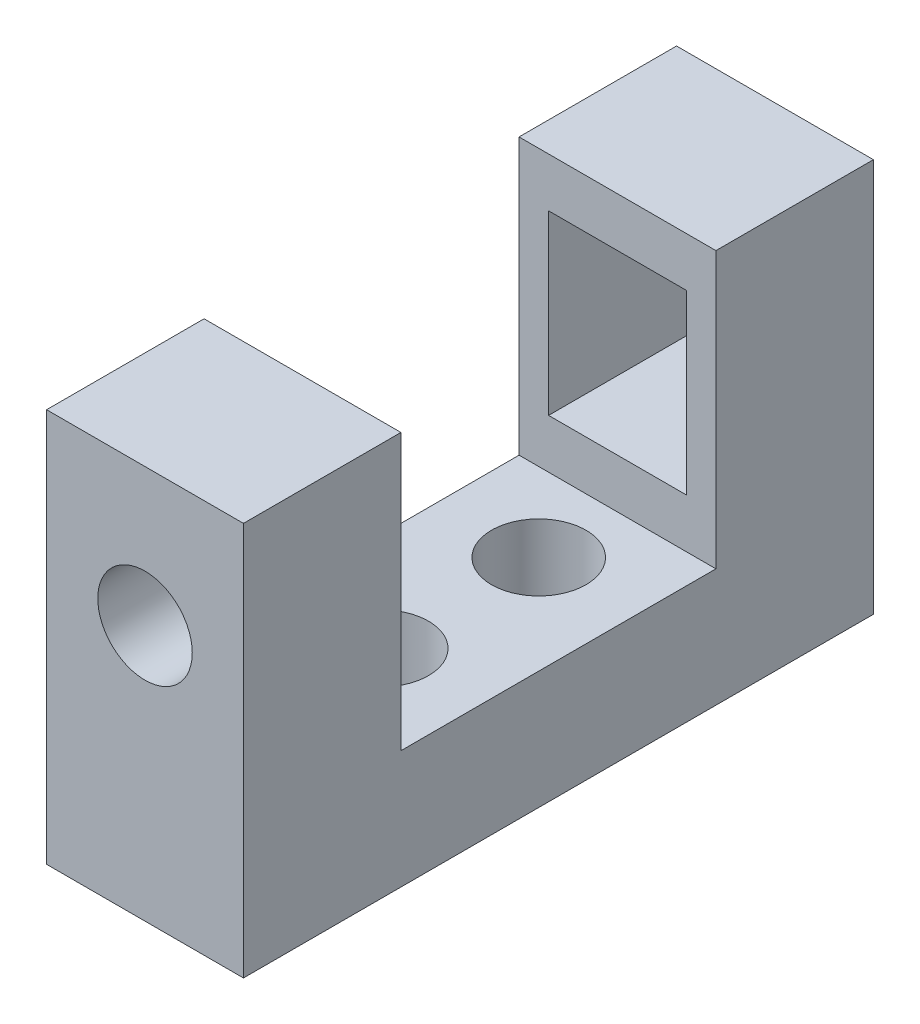
ISO-10303-21;
HEADER;
FILE_DESCRIPTION(('STEP AP214'),'2;1');
FILE_NAME('part.step','',(''),(''),'','','');
FILE_SCHEMA(('AUTOMOTIVE_DESIGN { 1 0 10303 214 1 1 1 1 }'));
ENDSEC;
DATA;
#1=APPLICATION_CONTEXT('core data for automotive mechanical design processes');
#2=APPLICATION_PROTOCOL_DEFINITION('international standard','automotive_design',2000,#1);
#3=PRODUCT_CONTEXT('',#1,'mechanical');
#4=PRODUCT('Part','Part','',(#3));
#5=PRODUCT_RELATED_PRODUCT_CATEGORY('part','',(#4));
#6=PRODUCT_DEFINITION_FORMATION('','',#4);
#7=PRODUCT_DEFINITION_CONTEXT('part definition',#1,'design');
#8=PRODUCT_DEFINITION('design','',#6,#7);
#9=PRODUCT_DEFINITION_SHAPE('','',#8);
#10=(LENGTH_UNIT() NAMED_UNIT(*) SI_UNIT(.MILLI.,.METRE.));
#11=(NAMED_UNIT(*) PLANE_ANGLE_UNIT() SI_UNIT($,.RADIAN.));
#12=(NAMED_UNIT(*) SI_UNIT($,.STERADIAN.) SOLID_ANGLE_UNIT());
#13=UNCERTAINTY_MEASURE_WITH_UNIT(LENGTH_MEASURE(1.E-05),#10,'distance_accuracy_value','');
#14=(GEOMETRIC_REPRESENTATION_CONTEXT(3) GLOBAL_UNCERTAINTY_ASSIGNED_CONTEXT((#13)) GLOBAL_UNIT_ASSIGNED_CONTEXT((#10,
#11,#12)) REPRESENTATION_CONTEXT('',''));
#15=CARTESIAN_POINT('',(0.,0.,0.));
#16=DIRECTION('',(0.,0.,1.));
#17=DIRECTION('',(1.,0.,0.));
#18=AXIS2_PLACEMENT_3D('',#15,#16,#17);
#19=CARTESIAN_POINT('',(2.5,3.5,2.));
#20=DIRECTION('',(-1.,0.,0.));
#21=DIRECTION('',(0.,-1.,0.));
#22=AXIS2_PLACEMENT_3D('',#19,#20,#21);
#23=PLANE('',#22);
#24=DIRECTION('',(0.,1.,0.));
#25=VECTOR('',#24,1.);
#26=CARTESIAN_POINT('',(2.5,3.5,-2.));
#27=LINE('',#26,#25);
#28=CARTESIAN_POINT('',(2.5,-6.5,-2.));
#29=VERTEX_POINT('',#28);
#30=CARTESIAN_POINT('',(2.5,3.5,-2.));
#31=VERTEX_POINT('',#30);
#32=EDGE_CURVE('E122',#29,#31,#27,.T.);
#33=ORIENTED_EDGE('',*,*,#32,.T.);
#34=DIRECTION('',(0.,0.,-1.));
#35=VECTOR('',#34,1.);
#36=CARTESIAN_POINT('',(2.5,3.5,2.));
#37=LINE('',#36,#35);
#38=CARTESIAN_POINT('',(2.5,3.5,2.));
#39=VERTEX_POINT('',#38);
#40=EDGE_CURVE('E11',#39,#31,#37,.T.);
#41=ORIENTED_EDGE('',*,*,#40,.F.);
#42=DIRECTION('',(0.,1.,0.));
#43=VECTOR('',#42,1.);
#44=CARTESIAN_POINT('',(2.5,3.5,2.));
#45=LINE('',#44,#43);
#46=CARTESIAN_POINT('',(2.5,-3.5,2.));
#47=VERTEX_POINT('',#46);
#48=EDGE_CURVE('E158',#47,#39,#45,.T.);
#49=ORIENTED_EDGE('',*,*,#48,.F.);
#50=DIRECTION('',(0.,0.,1.));
#51=VECTOR('',#50,1.);
#52=CARTESIAN_POINT('',(2.5,-3.5,2.));
#53=LINE('',#52,#51);
#54=CARTESIAN_POINT('',(2.5,-3.5,10.));
#55=VERTEX_POINT('',#54);
#56=EDGE_CURVE('E152',#47,#55,#53,.T.);
#57=ORIENTED_EDGE('',*,*,#56,.T.);
#58=DIRECTION('',(0.,-1.,0.));
#59=VECTOR('',#58,1.);
#60=CARTESIAN_POINT('',(2.5,3.5,10.));
#61=LINE('',#60,#59);
#62=CARTESIAN_POINT('',(2.5,3.5,10.));
#63=VERTEX_POINT('',#62);
#64=EDGE_CURVE('E154',#63,#55,#61,.T.);
#65=ORIENTED_EDGE('',*,*,#64,.F.);
#66=DIRECTION('',(0.,0.,-1.));
#67=VECTOR('',#66,1.);
#68=CARTESIAN_POINT('',(2.5,3.5,14.));
#69=LINE('',#68,#67);
#70=CARTESIAN_POINT('',(2.5,3.5,14.));
#71=VERTEX_POINT('',#70);
#72=EDGE_CURVE('E193',#71,#63,#69,.T.);
#73=ORIENTED_EDGE('',*,*,#72,.F.);
#74=DIRECTION('',(0.,1.,0.));
#75=VECTOR('',#74,1.);
#76=CARTESIAN_POINT('',(2.5,-6.5,14.));
#77=LINE('',#76,#75);
#78=CARTESIAN_POINT('',(2.5,-6.5,14.));
#79=VERTEX_POINT('',#78);
#80=EDGE_CURVE('E132',#79,#71,#77,.T.);
#81=ORIENTED_EDGE('',*,*,#80,.F.);
#82=DIRECTION('',(0.,0.,1.));
#83=VECTOR('',#82,1.);
#84=CARTESIAN_POINT('',(2.5,-6.5,2.));
#85=LINE('',#84,#83);
#86=EDGE_CURVE('E135',#29,#79,#85,.T.);
#87=ORIENTED_EDGE('',*,*,#86,.F.);
#88=EDGE_LOOP('',(#33,#41,#49,#57,#65,#73,#81,#87));
#89=FACE_BOUND('',#88,.T.);
#90=ADVANCED_FACE('F33',(#89),#23,.F.);
#91=CARTESIAN_POINT('',(-2.5,3.5,2.));
#92=DIRECTION('',(0.,-1.,0.));
#93=DIRECTION('',(0.,0.,-1.));
#94=AXIS2_PLACEMENT_3D('',#91,#92,#93);
#95=PLANE('',#94);
#96=DIRECTION('',(-1.,0.,0.));
#97=VECTOR('',#96,1.);
#98=CARTESIAN_POINT('',(-2.5,3.5,-2.));
#99=LINE('',#98,#97);
#100=CARTESIAN_POINT('',(-2.5,3.5,-2.));
#101=VERTEX_POINT('',#100);
#102=EDGE_CURVE('E129',#31,#101,#99,.T.);
#103=ORIENTED_EDGE('',*,*,#102,.T.);
#104=DIRECTION('',(0.,0.,-1.));
#105=VECTOR('',#104,1.);
#106=CARTESIAN_POINT('',(-2.5,3.5,2.));
#107=LINE('',#106,#105);
#108=CARTESIAN_POINT('',(-2.5,3.5,2.));
#109=VERTEX_POINT('',#108);
#110=EDGE_CURVE('E40',#109,#101,#107,.T.);
#111=ORIENTED_EDGE('',*,*,#110,.F.);
#112=DIRECTION('',(-1.,0.,0.));
#113=VECTOR('',#112,1.);
#114=CARTESIAN_POINT('',(-2.5,3.5,2.));
#115=LINE('',#114,#113);
#116=EDGE_CURVE('E161',#39,#109,#115,.T.);
#117=ORIENTED_EDGE('',*,*,#116,.F.);
#118=ORIENTED_EDGE('',*,*,#40,.T.);
#119=EDGE_LOOP('',(#103,#111,#117,#118));
#120=FACE_BOUND('',#119,.T.);
#121=ADVANCED_FACE('F177',(#120),#95,.F.);
#122=CARTESIAN_POINT('',(-2.5,3.5,2.));
#123=DIRECTION('',(1.,0.,0.));
#124=DIRECTION('',(0.,1.,0.));
#125=AXIS2_PLACEMENT_3D('',#122,#123,#124);
#126=PLANE('',#125);
#127=DIRECTION('',(0.,-1.,0.));
#128=VECTOR('',#127,1.);
#129=CARTESIAN_POINT('',(-2.5,3.5,-2.));
#130=LINE('',#129,#128);
#131=CARTESIAN_POINT('',(-2.5,-6.5,-2.));
#132=VERTEX_POINT('',#131);
#133=EDGE_CURVE('E162',#101,#132,#130,.T.);
#134=ORIENTED_EDGE('',*,*,#133,.T.);
#135=DIRECTION('',(0.,0.,-1.));
#136=VECTOR('',#135,1.);
#137=CARTESIAN_POINT('',(-2.5,-6.5,-2.));
#138=LINE('',#137,#136);
#139=CARTESIAN_POINT('',(-2.5,-6.5,14.));
#140=VERTEX_POINT('',#139);
#141=EDGE_CURVE('E144',#140,#132,#138,.T.);
#142=ORIENTED_EDGE('',*,*,#141,.F.);
#143=DIRECTION('',(0.,1.,0.));
#144=VECTOR('',#143,1.);
#145=CARTESIAN_POINT('',(-2.5,-6.5,14.));
#146=LINE('',#145,#144);
#147=CARTESIAN_POINT('',(-2.5,3.5,14.));
#148=VERTEX_POINT('',#147);
#149=EDGE_CURVE('E151',#140,#148,#146,.T.);
#150=ORIENTED_EDGE('',*,*,#149,.T.);
#151=DIRECTION('',(0.,0.,1.));
#152=VECTOR('',#151,1.);
#153=CARTESIAN_POINT('',(-2.5,3.5,14.));
#154=LINE('',#153,#152);
#155=CARTESIAN_POINT('',(-2.5,3.5,10.));
#156=VERTEX_POINT('',#155);
#157=EDGE_CURVE('E214',#156,#148,#154,.T.);
#158=ORIENTED_EDGE('',*,*,#157,.F.);
#159=DIRECTION('',(0.,-1.,0.));
#160=VECTOR('',#159,1.);
#161=CARTESIAN_POINT('',(-2.5,3.5,10.));
#162=LINE('',#161,#160);
#163=CARTESIAN_POINT('',(-2.5,-3.5,10.));
#164=VERTEX_POINT('',#163);
#165=EDGE_CURVE('E206',#156,#164,#162,.T.);
#166=ORIENTED_EDGE('',*,*,#165,.T.);
#167=DIRECTION('',(0.,0.,-1.));
#168=VECTOR('',#167,1.);
#169=CARTESIAN_POINT('',(-2.5,-3.5,2.));
#170=LINE('',#169,#168);
#171=CARTESIAN_POINT('',(-2.5,-3.5,2.));
#172=VERTEX_POINT('',#171);
#173=EDGE_CURVE('E146',#164,#172,#170,.T.);
#174=ORIENTED_EDGE('',*,*,#173,.T.);
#175=DIRECTION('',(0.,-1.,0.));
#176=VECTOR('',#175,1.);
#177=CARTESIAN_POINT('',(-2.5,3.5,2.));
#178=LINE('',#177,#176);
#179=EDGE_CURVE('E164',#109,#172,#178,.T.);
#180=ORIENTED_EDGE('',*,*,#179,.F.);
#181=ORIENTED_EDGE('',*,*,#110,.T.);
#182=EDGE_LOOP('',(#134,#142,#150,#158,#166,#174,#180,#181));
#183=FACE_BOUND('',#182,.T.);
#184=ADVANCED_FACE('F175',(#183),#126,.F.);
#185=CARTESIAN_POINT('',(0.,0.,2.));
#186=DIRECTION('',(0.,0.,1.));
#187=DIRECTION('',(1.,0.,0.));
#188=AXIS2_PLACEMENT_3D('',#185,#186,#187);
#189=PLANE('',#188);
#190=DIRECTION('',(0.,-1.,0.));
#191=VECTOR('',#190,1.);
#192=CARTESIAN_POINT('',(1.74999999997624,2.24999999999691,2.));
#193=LINE('',#192,#191);
#194=CARTESIAN_POINT('',(1.74999999997624,2.24999999999691,2.));
#195=VERTEX_POINT('',#194);
#196=CARTESIAN_POINT('',(1.74999999997624,-2.2500000000031,2.));
#197=VERTEX_POINT('',#196);
#198=EDGE_CURVE('E226',#195,#197,#193,.T.);
#199=ORIENTED_EDGE('',*,*,#198,.T.);
#200=DIRECTION('',(-1.,0.,0.));
#201=VECTOR('',#200,1.);
#202=CARTESIAN_POINT('',(-1.75000000002376,-2.25000000000309,2.));
#203=LINE('',#202,#201);
#204=CARTESIAN_POINT('',(-1.75000000002376,-2.25000000000309,2.));
#205=VERTEX_POINT('',#204);
#206=EDGE_CURVE('E225',#197,#205,#203,.T.);
#207=ORIENTED_EDGE('',*,*,#206,.T.);
#208=DIRECTION('',(0.,1.,0.));
#209=VECTOR('',#208,1.);
#210=CARTESIAN_POINT('',(-1.75000000002376,2.24999999999691,2.));
#211=LINE('',#210,#209);
#212=CARTESIAN_POINT('',(-1.75000000002376,2.24999999999691,2.));
#213=VERTEX_POINT('',#212);
#214=EDGE_CURVE('E229',#205,#213,#211,.T.);
#215=ORIENTED_EDGE('',*,*,#214,.T.);
#216=DIRECTION('',(1.,0.,0.));
#217=VECTOR('',#216,1.);
#218=CARTESIAN_POINT('',(-1.75000000002376,2.24999999999691,2.));
#219=LINE('',#218,#217);
#220=EDGE_CURVE('E222',#213,#195,#219,.T.);
#221=ORIENTED_EDGE('',*,*,#220,.T.);
#222=EDGE_LOOP('',(#199,#207,#215,#221));
#223=FACE_BOUND('',#222,.T.);
#224=ORIENTED_EDGE('',*,*,#48,.T.);
#225=ORIENTED_EDGE('',*,*,#116,.T.);
#226=ORIENTED_EDGE('',*,*,#179,.T.);
#227=DIRECTION('',(1.,0.,0.));
#228=VECTOR('',#227,1.);
#229=CARTESIAN_POINT('',(-2.5,-3.5,2.));
#230=LINE('',#229,#228);
#231=EDGE_CURVE('E167',#172,#47,#230,.T.);
#232=ORIENTED_EDGE('',*,*,#231,.T.);
#233=EDGE_LOOP('',(#224,#225,#226,#232));
#234=FACE_BOUND('',#233,.T.);
#235=ADVANCED_FACE('F182',(#223,#234),#189,.T.);
#236=CARTESIAN_POINT('',(0.,0.,-2.));
#237=DIRECTION('',(0.,0.,1.));
#238=DIRECTION('',(1.,0.,0.));
#239=AXIS2_PLACEMENT_3D('',#236,#237,#238);
#240=PLANE('',#239);
#241=DIRECTION('',(-1.,0.,0.));
#242=VECTOR('',#241,1.);
#243=CARTESIAN_POINT('',(-1.75000000002376,-2.25000000000309,-2.));
#244=LINE('',#243,#242);
#245=CARTESIAN_POINT('',(1.74999999997624,-2.2500000000031,-2.));
#246=VERTEX_POINT('',#245);
#247=CARTESIAN_POINT('',(-1.75000000002376,-2.25000000000309,-2.));
#248=VERTEX_POINT('',#247);
#249=EDGE_CURVE('E246',#246,#248,#244,.T.);
#250=ORIENTED_EDGE('',*,*,#249,.F.);
#251=DIRECTION('',(0.,-1.,0.));
#252=VECTOR('',#251,1.);
#253=CARTESIAN_POINT('',(1.74999999997624,2.24999999999691,-2.));
#254=LINE('',#253,#252);
#255=CARTESIAN_POINT('',(1.74999999997624,2.24999999999691,-2.));
#256=VERTEX_POINT('',#255);
#257=EDGE_CURVE('E242',#256,#246,#254,.T.);
#258=ORIENTED_EDGE('',*,*,#257,.F.);
#259=DIRECTION('',(1.,0.,0.));
#260=VECTOR('',#259,1.);
#261=CARTESIAN_POINT('',(-1.75000000002376,2.24999999999691,-2.));
#262=LINE('',#261,#260);
#263=CARTESIAN_POINT('',(-1.75000000002376,2.24999999999691,-2.));
#264=VERTEX_POINT('',#263);
#265=EDGE_CURVE('E240',#264,#256,#262,.T.);
#266=ORIENTED_EDGE('',*,*,#265,.F.);
#267=DIRECTION('',(0.,1.,0.));
#268=VECTOR('',#267,1.);
#269=CARTESIAN_POINT('',(-1.75000000002376,2.24999999999691,-2.));
#270=LINE('',#269,#268);
#271=EDGE_CURVE('E55',#248,#264,#270,.T.);
#272=ORIENTED_EDGE('',*,*,#271,.F.);
#273=EDGE_LOOP('',(#250,#258,#266,#272));
#274=FACE_BOUND('',#273,.T.);
#275=ORIENTED_EDGE('',*,*,#32,.F.);
#276=DIRECTION('',(1.,0.,0.));
#277=VECTOR('',#276,1.);
#278=CARTESIAN_POINT('',(-2.5,-6.5,-2.));
#279=LINE('',#278,#277);
#280=EDGE_CURVE('E127',#132,#29,#279,.T.);
#281=ORIENTED_EDGE('',*,*,#280,.F.);
#282=ORIENTED_EDGE('',*,*,#133,.F.);
#283=ORIENTED_EDGE('',*,*,#102,.F.);
#284=EDGE_LOOP('',(#275,#281,#282,#283));
#285=FACE_BOUND('',#284,.T.);
#286=ADVANCED_FACE('F124',(#274,#285),#240,.F.);
#287=CARTESIAN_POINT('',(2.5,-6.5,14.));
#288=DIRECTION('',(0.,0.,-1.));
#289=DIRECTION('',(-1.,0.,0.));
#290=AXIS2_PLACEMENT_3D('',#287,#288,#289);
#291=PLANE('',#290);
#292=CARTESIAN_POINT('',(0.,0.,14.));
#293=DIRECTION('',(0.,0.,1.));
#294=DIRECTION('',(1.,0.,0.));
#295=AXIS2_PLACEMENT_3D('',#292,#293,#294);
#296=CIRCLE('',#295,1.2);
#297=CARTESIAN_POINT('',(1.2,0.,14.));
#298=VERTEX_POINT('',#297);
#299=EDGE_CURVE('E200',#298,#298,#296,.T.);
#300=ORIENTED_EDGE('',*,*,#299,.F.);
#301=EDGE_LOOP('',(#300));
#302=FACE_BOUND('',#301,.T.);
#303=DIRECTION('',(-1.,0.,0.));
#304=VECTOR('',#303,1.);
#305=CARTESIAN_POINT('',(2.5,-6.5,14.));
#306=LINE('',#305,#304);
#307=EDGE_CURVE('E139',#79,#140,#306,.T.);
#308=ORIENTED_EDGE('',*,*,#307,.F.);
#309=ORIENTED_EDGE('',*,*,#80,.T.);
#310=DIRECTION('',(1.,0.,0.));
#311=VECTOR('',#310,1.);
#312=CARTESIAN_POINT('',(2.5,3.5,14.));
#313=LINE('',#312,#311);
#314=EDGE_CURVE('E204',#148,#71,#313,.T.);
#315=ORIENTED_EDGE('',*,*,#314,.F.);
#316=ORIENTED_EDGE('',*,*,#149,.F.);
#317=EDGE_LOOP('',(#308,#309,#315,#316));
#318=FACE_BOUND('',#317,.T.);
#319=ADVANCED_FACE('F293',(#302,#318),#291,.F.);
#320=CARTESIAN_POINT('',(0.,-6.5,0.));
#321=DIRECTION('',(0.,-1.,0.));
#322=DIRECTION('',(0.,0.,-1.));
#323=AXIS2_PLACEMENT_3D('',#320,#321,#322);
#324=PLANE('',#323);
#325=ORIENTED_EDGE('',*,*,#86,.T.);
#326=ORIENTED_EDGE('',*,*,#307,.T.);
#327=ORIENTED_EDGE('',*,*,#141,.T.);
#328=ORIENTED_EDGE('',*,*,#280,.T.);
#329=EDGE_LOOP('',(#325,#326,#327,#328));
#330=FACE_BOUND('',#329,.T.);
#331=CARTESIAN_POINT('',(0.,-6.5,8.));
#332=DIRECTION('',(0.,-1.,0.));
#333=DIRECTION('',(0.,0.,-1.));
#334=AXIS2_PLACEMENT_3D('',#331,#332,#333);
#335=CIRCLE('',#334,1.2);
#336=CARTESIAN_POINT('',(0.,-6.5,6.8));
#337=VERTEX_POINT('',#336);
#338=EDGE_CURVE('E255',#337,#337,#335,.T.);
#339=ORIENTED_EDGE('',*,*,#338,.F.);
#340=EDGE_LOOP('',(#339));
#341=FACE_BOUND('',#340,.T.);
#342=CARTESIAN_POINT('',(0.,-6.5,4.));
#343=DIRECTION('',(0.,-1.,0.));
#344=DIRECTION('',(0.,0.,-1.));
#345=AXIS2_PLACEMENT_3D('',#342,#343,#344);
#346=CIRCLE('',#345,1.2);
#347=CARTESIAN_POINT('',(0.,-6.5,2.8));
#348=VERTEX_POINT('',#347);
#349=EDGE_CURVE('E243',#348,#348,#346,.T.);
#350=ORIENTED_EDGE('',*,*,#349,.F.);
#351=EDGE_LOOP('',(#350));
#352=FACE_BOUND('',#351,.T.);
#353=ADVANCED_FACE('F141',(#330,#341,#352),#324,.T.);
#354=CARTESIAN_POINT('',(2.5,3.5,10.));
#355=DIRECTION('',(0.,0.,1.));
#356=DIRECTION('',(1.,0.,0.));
#357=AXIS2_PLACEMENT_3D('',#354,#355,#356);
#358=PLANE('',#357);
#359=CARTESIAN_POINT('',(0.,0.,10.));
#360=DIRECTION('',(0.,0.,1.));
#361=DIRECTION('',(1.,0.,0.));
#362=AXIS2_PLACEMENT_3D('',#359,#360,#361);
#363=CIRCLE('',#362,1.2);
#364=CARTESIAN_POINT('',(1.2,0.,10.));
#365=VERTEX_POINT('',#364);
#366=EDGE_CURVE('E194',#365,#365,#363,.F.);
#367=ORIENTED_EDGE('',*,*,#366,.F.);
#368=EDGE_LOOP('',(#367));
#369=FACE_BOUND('',#368,.T.);
#370=DIRECTION('',(-1.,0.,0.));
#371=VECTOR('',#370,1.);
#372=CARTESIAN_POINT('',(2.5,-3.5,10.));
#373=LINE('',#372,#371);
#374=EDGE_CURVE('E189',#55,#164,#373,.T.);
#375=ORIENTED_EDGE('',*,*,#374,.T.);
#376=ORIENTED_EDGE('',*,*,#165,.F.);
#377=DIRECTION('',(-1.,0.,0.));
#378=VECTOR('',#377,1.);
#379=CARTESIAN_POINT('',(2.5,3.5,10.));
#380=LINE('',#379,#378);
#381=EDGE_CURVE('E197',#63,#156,#380,.T.);
#382=ORIENTED_EDGE('',*,*,#381,.F.);
#383=ORIENTED_EDGE('',*,*,#64,.T.);
#384=EDGE_LOOP('',(#375,#376,#382,#383));
#385=FACE_BOUND('',#384,.T.);
#386=ADVANCED_FACE('F207',(#369,#385),#358,.F.);
#387=CARTESIAN_POINT('',(0.,3.5,0.));
#388=DIRECTION('',(0.,1.,0.));
#389=DIRECTION('',(0.,0.,1.));
#390=AXIS2_PLACEMENT_3D('',#387,#388,#389);
#391=PLANE('',#390);
#392=ORIENTED_EDGE('',*,*,#72,.T.);
#393=ORIENTED_EDGE('',*,*,#381,.T.);
#394=ORIENTED_EDGE('',*,*,#157,.T.);
#395=ORIENTED_EDGE('',*,*,#314,.T.);
#396=EDGE_LOOP('',(#392,#393,#394,#395));
#397=FACE_BOUND('',#396,.T.);
#398=ADVANCED_FACE('F210',(#397),#391,.T.);
#399=CARTESIAN_POINT('',(0.,-3.5,0.));
#400=DIRECTION('',(0.,1.,0.));
#401=DIRECTION('',(0.,0.,1.));
#402=AXIS2_PLACEMENT_3D('',#399,#400,#401);
#403=PLANE('',#402);
#404=ORIENTED_EDGE('',*,*,#56,.F.);
#405=ORIENTED_EDGE('',*,*,#231,.F.);
#406=ORIENTED_EDGE('',*,*,#173,.F.);
#407=ORIENTED_EDGE('',*,*,#374,.F.);
#408=EDGE_LOOP('',(#404,#405,#406,#407));
#409=FACE_BOUND('',#408,.T.);
#410=CARTESIAN_POINT('',(0.,-3.5,8.));
#411=DIRECTION('',(0.,1.,0.));
#412=DIRECTION('',(0.,0.,1.));
#413=AXIS2_PLACEMENT_3D('',#410,#411,#412);
#414=CIRCLE('',#413,1.2);
#415=CARTESIAN_POINT('',(0.,-3.5,9.2));
#416=VERTEX_POINT('',#415);
#417=EDGE_CURVE('E258',#416,#416,#414,.T.);
#418=ORIENTED_EDGE('',*,*,#417,.F.);
#419=EDGE_LOOP('',(#418));
#420=FACE_BOUND('',#419,.T.);
#421=CARTESIAN_POINT('',(0.,-3.5,4.));
#422=DIRECTION('',(0.,1.,0.));
#423=DIRECTION('',(0.,0.,1.));
#424=AXIS2_PLACEMENT_3D('',#421,#422,#423);
#425=CIRCLE('',#424,1.2);
#426=CARTESIAN_POINT('',(0.,-3.5,5.2));
#427=VERTEX_POINT('',#426);
#428=EDGE_CURVE('E252',#427,#427,#425,.T.);
#429=ORIENTED_EDGE('',*,*,#428,.F.);
#430=EDGE_LOOP('',(#429));
#431=FACE_BOUND('',#430,.T.);
#432=ADVANCED_FACE('F186',(#409,#420,#431),#403,.T.);
#433=CARTESIAN_POINT('',(0.,0.,14.));
#434=DIRECTION('',(0.,0.,1.));
#435=DIRECTION('',(1.,0.,0.));
#436=AXIS2_PLACEMENT_3D('',#433,#434,#435);
#437=CYLINDRICAL_SURFACE('',#436,1.2);
#438=ORIENTED_EDGE('',*,*,#366,.T.);
#439=EDGE_LOOP('',(#438));
#440=FACE_BOUND('',#439,.T.);
#441=ORIENTED_EDGE('',*,*,#299,.T.);
#442=EDGE_LOOP('',(#441));
#443=FACE_BOUND('',#442,.T.);
#444=ADVANCED_FACE('F265',(#440,#443),#437,.F.);
#445=CARTESIAN_POINT('',(1.74999999997624,2.24999999999691,7.70087712549569));
#446=DIRECTION('',(1.,0.,0.));
#447=DIRECTION('',(0.,1.,0.));
#448=AXIS2_PLACEMENT_3D('',#445,#446,#447);
#449=PLANE('',#448);
#450=DIRECTION('',(0.,0.,-1.));
#451=VECTOR('',#450,1.);
#452=CARTESIAN_POINT('',(1.74999999997624,2.24999999999691,7.70087712549569));
#453=LINE('',#452,#451);
#454=EDGE_CURVE('E47',#195,#256,#453,.T.);
#455=ORIENTED_EDGE('',*,*,#454,.T.);
#456=ORIENTED_EDGE('',*,*,#257,.T.);
#457=DIRECTION('',(0.,0.,-1.));
#458=VECTOR('',#457,1.);
#459=CARTESIAN_POINT('',(1.74999999997624,-2.2500000000031,7.70087712549569));
#460=LINE('',#459,#458);
#461=EDGE_CURVE('E223',#197,#246,#460,.T.);
#462=ORIENTED_EDGE('',*,*,#461,.F.);
#463=ORIENTED_EDGE('',*,*,#198,.F.);
#464=EDGE_LOOP('',(#455,#456,#462,#463));
#465=FACE_BOUND('',#464,.T.);
#466=ADVANCED_FACE('F310',(#465),#449,.F.);
#467=CARTESIAN_POINT('',(-1.75000000002376,-2.25000000000309,7.70087712549569));
#468=DIRECTION('',(0.,-1.,0.));
#469=DIRECTION('',(1.,0.,0.));
#470=AXIS2_PLACEMENT_3D('',#467,#468,#469);
#471=PLANE('',#470);
#472=ORIENTED_EDGE('',*,*,#461,.T.);
#473=ORIENTED_EDGE('',*,*,#249,.T.);
#474=DIRECTION('',(0.,0.,-1.));
#475=VECTOR('',#474,1.);
#476=CARTESIAN_POINT('',(-1.75000000002376,-2.25000000000309,7.70087712549569));
#477=LINE('',#476,#475);
#478=EDGE_CURVE('E227',#205,#248,#477,.T.);
#479=ORIENTED_EDGE('',*,*,#478,.F.);
#480=ORIENTED_EDGE('',*,*,#206,.F.);
#481=EDGE_LOOP('',(#472,#473,#479,#480));
#482=FACE_BOUND('',#481,.T.);
#483=ADVANCED_FACE('F314',(#482),#471,.F.);
#484=CARTESIAN_POINT('',(-1.75000000002376,2.24999999999691,7.70087712549569));
#485=DIRECTION('',(-1.,0.,0.));
#486=DIRECTION('',(0.,-1.,0.));
#487=AXIS2_PLACEMENT_3D('',#484,#485,#486);
#488=PLANE('',#487);
#489=ORIENTED_EDGE('',*,*,#478,.T.);
#490=ORIENTED_EDGE('',*,*,#271,.T.);
#491=DIRECTION('',(0.,0.,-1.));
#492=VECTOR('',#491,1.);
#493=CARTESIAN_POINT('',(-1.75000000002376,2.24999999999691,7.70087712549569));
#494=LINE('',#493,#492);
#495=EDGE_CURVE('E230',#213,#264,#494,.T.);
#496=ORIENTED_EDGE('',*,*,#495,.F.);
#497=ORIENTED_EDGE('',*,*,#214,.F.);
#498=EDGE_LOOP('',(#489,#490,#496,#497));
#499=FACE_BOUND('',#498,.T.);
#500=ADVANCED_FACE('F280',(#499),#488,.F.);
#501=CARTESIAN_POINT('',(-1.75000000002376,2.24999999999691,7.70087712549569));
#502=DIRECTION('',(0.,1.,0.));
#503=DIRECTION('',(-1.,0.,0.));
#504=AXIS2_PLACEMENT_3D('',#501,#502,#503);
#505=PLANE('',#504);
#506=ORIENTED_EDGE('',*,*,#495,.T.);
#507=ORIENTED_EDGE('',*,*,#265,.T.);
#508=ORIENTED_EDGE('',*,*,#454,.F.);
#509=ORIENTED_EDGE('',*,*,#220,.F.);
#510=EDGE_LOOP('',(#506,#507,#508,#509));
#511=FACE_BOUND('',#510,.T.);
#512=ADVANCED_FACE('F271',(#511),#505,.F.);
#513=CARTESIAN_POINT('',(0.,-3.5,4.));
#514=DIRECTION('',(0.,1.,0.));
#515=DIRECTION('',(0.,0.,1.));
#516=AXIS2_PLACEMENT_3D('',#513,#514,#515);
#517=CYLINDRICAL_SURFACE('',#516,1.2);
#518=ORIENTED_EDGE('',*,*,#349,.T.);
#519=EDGE_LOOP('',(#518));
#520=FACE_BOUND('',#519,.T.);
#521=ORIENTED_EDGE('',*,*,#428,.T.);
#522=EDGE_LOOP('',(#521));
#523=FACE_BOUND('',#522,.T.);
#524=ADVANCED_FACE('F269',(#520,#523),#517,.F.);
#525=CARTESIAN_POINT('',(0.,-3.5,8.));
#526=DIRECTION('',(0.,1.,0.));
#527=DIRECTION('',(0.,0.,1.));
#528=AXIS2_PLACEMENT_3D('',#525,#526,#527);
#529=CYLINDRICAL_SURFACE('',#528,1.2);
#530=ORIENTED_EDGE('',*,*,#338,.T.);
#531=EDGE_LOOP('',(#530));
#532=FACE_BOUND('',#531,.T.);
#533=ORIENTED_EDGE('',*,*,#417,.T.);
#534=EDGE_LOOP('',(#533));
#535=FACE_BOUND('',#534,.T.);
#536=ADVANCED_FACE('F262',(#532,#535),#529,.F.);
#537=CLOSED_SHELL('',(#90,#121,#184,#235,#286,#319,#353,#386,#398,#432,#444,#466,#483,#500,#512,
#524,#536));
#538=MANIFOLD_SOLID_BREP('B2',#537);
#539=ADVANCED_BREP_SHAPE_REPRESENTATION('',(#18,#538),#14);
#540=SHAPE_DEFINITION_REPRESENTATION(#9,#539);
ENDSEC;
END-ISO-10303-21;
